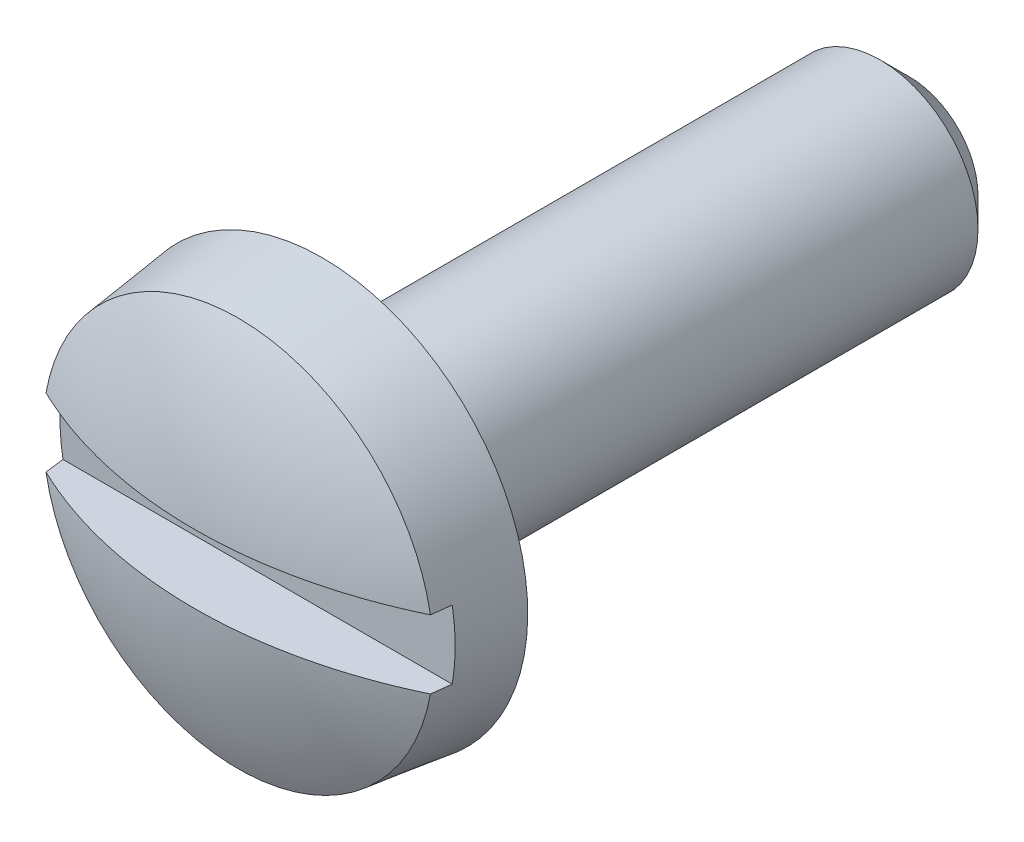
ISO-10303-21;
HEADER;
FILE_DESCRIPTION(('STEP AP214'),'2;1');
FILE_NAME('part.step','',(''),(''),'','','');
FILE_SCHEMA(('AUTOMOTIVE_DESIGN { 1 0 10303 214 1 1 1 1 }'));
ENDSEC;
DATA;
#1=APPLICATION_CONTEXT('core data for automotive mechanical design processes');
#2=APPLICATION_PROTOCOL_DEFINITION('international standard','automotive_design',2000,#1);
#3=PRODUCT_CONTEXT('',#1,'mechanical');
#4=PRODUCT('Part','Part','',(#3));
#5=PRODUCT_RELATED_PRODUCT_CATEGORY('part','',(#4));
#6=PRODUCT_DEFINITION_FORMATION('','',#4);
#7=PRODUCT_DEFINITION_CONTEXT('part definition',#1,'design');
#8=PRODUCT_DEFINITION('design','',#6,#7);
#9=PRODUCT_DEFINITION_SHAPE('','',#8);
#10=(LENGTH_UNIT() NAMED_UNIT(*) SI_UNIT(.MILLI.,.METRE.));
#11=(NAMED_UNIT(*) PLANE_ANGLE_UNIT() SI_UNIT($,.RADIAN.));
#12=(NAMED_UNIT(*) SI_UNIT($,.STERADIAN.) SOLID_ANGLE_UNIT());
#13=UNCERTAINTY_MEASURE_WITH_UNIT(LENGTH_MEASURE(1.E-05),#10,'distance_accuracy_value','');
#14=(GEOMETRIC_REPRESENTATION_CONTEXT(3) GLOBAL_UNCERTAINTY_ASSIGNED_CONTEXT((#13)) GLOBAL_UNIT_ASSIGNED_CONTEXT((#10,
#11,#12)) REPRESENTATION_CONTEXT('',''));
#15=CARTESIAN_POINT('',(0.,0.,0.));
#16=DIRECTION('',(0.,0.,1.));
#17=DIRECTION('',(1.,0.,0.));
#18=AXIS2_PLACEMENT_3D('',#15,#16,#17);
#19=CARTESIAN_POINT('',(0.,3.175,0.));
#20=DIRECTION('',(0.,0.,-1.));
#21=DIRECTION('',(-1.,0.,0.));
#22=AXIS2_PLACEMENT_3D('',#19,#20,#21);
#23=PLANE('',#22);
#24=CARTESIAN_POINT('',(0.,0.,0.));
#25=DIRECTION('',(0.,0.,1.));
#26=DIRECTION('',(1.,0.,0.));
#27=AXIS2_PLACEMENT_3D('',#24,#25,#26);
#28=CIRCLE('',#27,3.175);
#29=CARTESIAN_POINT('',(3.175,0.,0.));
#30=VERTEX_POINT('',#29);
#31=EDGE_CURVE('E57',#30,#30,#28,.T.);
#32=ORIENTED_EDGE('',*,*,#31,.T.);
#33=EDGE_LOOP('',(#32));
#34=FACE_BOUND('',#33,.T.);
#35=ADVANCED_FACE('F46',(#34),#23,.F.);
#36=CARTESIAN_POINT('',(0.,0.,-19.05));
#37=DIRECTION('',(0.,0.,1.));
#38=DIRECTION('',(1.,0.,0.));
#39=AXIS2_PLACEMENT_3D('',#36,#37,#38);
#40=PLANE('',#39);
#41=CARTESIAN_POINT('',(0.,0.,-19.05));
#42=DIRECTION('',(0.,0.,1.));
#43=DIRECTION('',(1.,0.,0.));
#44=AXIS2_PLACEMENT_3D('',#41,#42,#43);
#45=CIRCLE('',#44,2.2225);
#46=CARTESIAN_POINT('',(2.2225,0.,-19.05));
#47=VERTEX_POINT('',#46);
#48=EDGE_CURVE('E11',#47,#47,#45,.F.);
#49=ORIENTED_EDGE('',*,*,#48,.T.);
#50=EDGE_LOOP('',(#49));
#51=FACE_BOUND('',#50,.T.);
#52=ADVANCED_FACE('F67',(#51),#40,.F.);
#53=CARTESIAN_POINT('',(0.,0.,0.));
#54=DIRECTION('',(0.,0.,1.));
#55=DIRECTION('',(1.,0.,0.));
#56=AXIS2_PLACEMENT_3D('',#53,#54,#55);
#57=CYLINDRICAL_SURFACE('',#56,3.175);
#58=CARTESIAN_POINT('',(0.,0.,-18.0975));
#59=DIRECTION('',(0.,0.,1.));
#60=DIRECTION('',(1.,0.,0.));
#61=AXIS2_PLACEMENT_3D('',#58,#59,#60);
#62=CIRCLE('',#61,3.175);
#63=CARTESIAN_POINT('',(3.175,0.,-18.0975));
#64=VERTEX_POINT('',#63);
#65=EDGE_CURVE('E53',#64,#64,#62,.T.);
#66=ORIENTED_EDGE('',*,*,#65,.T.);
#67=EDGE_LOOP('',(#66));
#68=FACE_BOUND('',#67,.T.);
#69=ORIENTED_EDGE('',*,*,#31,.F.);
#70=EDGE_LOOP('',(#69));
#71=FACE_BOUND('',#70,.T.);
#72=ADVANCED_FACE('F65',(#68,#71),#57,.T.);
#73=CARTESIAN_POINT('',(0.,0.,-18.0975));
#74=DIRECTION('',(0.,0.,1.));
#75=DIRECTION('',(1.,0.,0.));
#76=AXIS2_PLACEMENT_3D('',#73,#74,#75);
#77=CONICAL_SURFACE('',#76,3.175,0.785398163397451);
#78=ORIENTED_EDGE('',*,*,#48,.F.);
#79=EDGE_LOOP('',(#78));
#80=FACE_BOUND('',#79,.T.);
#81=ORIENTED_EDGE('',*,*,#65,.F.);
#82=EDGE_LOOP('',(#81));
#83=FACE_BOUND('',#82,.T.);
#84=ADVANCED_FACE('F48',(#80,#83),#77,.T.);
#85=CLOSED_SHELL('',(#35,#52,#72,#84));
#86=MANIFOLD_SOLID_BREP('B2',#85);
#87=CARTESIAN_POINT('',(0.,0.,-10.2135901529645));
#88=DIRECTION('',(0.,0.,-1.));
#89=DIRECTION('',(0.,1.,0.));
#90=AXIS2_PLACEMENT_3D('',#87,#88,#89);
#91=SPHERICAL_SURFACE('',#90,14.4045901529645);
#92=CARTESIAN_POINT('',(0.,0.,2.72415));
#93=DIRECTION('',(0.,0.,-1.));
#94=DIRECTION('',(0.,1.,0.));
#95=AXIS2_PLACEMENT_3D('',#92,#93,#94);
#96=CIRCLE('',#95,6.33301643841637);
#97=CARTESIAN_POINT('',(-6.2347590688616,1.11125,2.72415));
#98=VERTEX_POINT('',#97);
#99=CARTESIAN_POINT('',(6.2347590688616,1.11125,2.72415));
#100=VERTEX_POINT('',#99);
#101=EDGE_CURVE('E202',#98,#100,#96,.T.);
#102=ORIENTED_EDGE('',*,*,#101,.F.);
#103=CARTESIAN_POINT('',(0.,1.11125,-10.2135901529645));
#104=DIRECTION('',(0.,1.,0.));
#105=DIRECTION('',(-1.,0.,0.));
#106=AXIS2_PLACEMENT_3D('',#103,#104,#105);
#107=CIRCLE('',#106,14.361662191835);
#108=EDGE_CURVE('E203',#98,#100,#107,.T.);
#109=ORIENTED_EDGE('',*,*,#108,.T.);
#110=EDGE_LOOP('',(#102,#109));
#111=FACE_BOUND('',#110,.T.);
#112=ADVANCED_FACE('F101',(#111),#91,.T.);
#113=CARTESIAN_POINT('',(0.,0.,0.));
#114=DIRECTION('',(0.,0.,1.));
#115=DIRECTION('',(1.,0.,0.));
#116=AXIS2_PLACEMENT_3D('',#113,#114,#115);
#117=PLANE('',#116);
#118=CARTESIAN_POINT('',(0.,0.,0.));
#119=DIRECTION('',(0.,0.,-1.));
#120=DIRECTION('',(0.,1.,0.));
#121=AXIS2_PLACEMENT_3D('',#118,#119,#120);
#122=CIRCLE('',#121,6.6675);
#123=CARTESIAN_POINT('',(0.,6.6675,0.));
#124=VERTEX_POINT('',#123);
#125=EDGE_CURVE('E205',#124,#124,#122,.T.);
#126=ORIENTED_EDGE('',*,*,#125,.T.);
#127=EDGE_LOOP('',(#126));
#128=FACE_BOUND('',#127,.T.);
#129=ADVANCED_FACE('F103',(#128),#117,.F.);
#130=CARTESIAN_POINT('',(0.,0.,2.72415));
#131=DIRECTION('',(0.,0.,-1.));
#132=DIRECTION('',(0.,1.,0.));
#133=AXIS2_PLACEMENT_3D('',#130,#131,#132);
#134=CONICAL_SURFACE('',#133,6.33301643841637,0.122173047639597);
#135=CARTESIAN_POINT('',(0.,0.,2.0955));
#136=DIRECTION('',(0.,0.,1.));
#137=DIRECTION('',(1.,0.,0.));
#138=AXIS2_PLACEMENT_3D('',#135,#136,#137);
#139=CIRCLE('',#138,6.41020495262798);
#140=CARTESIAN_POINT('',(-6.31314905353867,1.11125,2.0955));
#141=VERTEX_POINT('',#140);
#142=CARTESIAN_POINT('',(-6.31314905353867,-1.11125,2.0955));
#143=VERTEX_POINT('',#142);
#144=EDGE_CURVE('E44',#141,#143,#139,.T.);
#145=ORIENTED_EDGE('',*,*,#144,.F.);
#146=CARTESIAN_POINT('',(-7.65181904568313,1.11125,-8.67038739499354));
#147=CARTESIAN_POINT('',(-7.41941652773067,1.11125,-6.79734801947012));
#148=CARTESIAN_POINT('',(-7.18681769576233,1.11125,-4.92433296235308));
#149=CARTESIAN_POINT('',(-6.72104041720601,1.11125,-1.17837530600329));
#150=CARTESIAN_POINT('',(-6.48786197073327,1.11125,0.694567293243784));
#151=CARTESIAN_POINT('',(-6.02073835613319,1.11125,4.4403571835926));
#152=CARTESIAN_POINT('',(-5.78679318791327,1.11125,6.3132044746828));
#153=CARTESIAN_POINT('',(-5.31775749177123,1.11125,10.0587559766337));
#154=CARTESIAN_POINT('',(-5.08266696361649,1.11125,11.9314601874652));
#155=CARTESIAN_POINT('',(-4.84681446986026,1.11125,13.8040687048268));
#156=B_SPLINE_CURVE_WITH_KNOTS('',3,(#146,#147,#148,#149,#150,#151,#152,#153,#154,#155),
.UNSPECIFIED.,.F.,.F.,(4,2,2,2,4),(0.,5.66220693258291,11.3244127396948,16.9866192306255,
22.6488268715924),.UNSPECIFIED.);
#157=EDGE_CURVE('E160',#141,#98,#156,.T.);
#158=ORIENTED_EDGE('',*,*,#157,.T.);
#159=ORIENTED_EDGE('',*,*,#101,.T.);
#160=CARTESIAN_POINT('',(4.84681446986026,1.11125,13.8040687048268));
#161=CARTESIAN_POINT('',(5.03145446269914,1.11125,12.3381843355245));
#162=CARTESIAN_POINT('',(5.21561228433992,1.11125,10.8722393521325));
#163=CARTESIAN_POINT('',(5.58316918920786,1.11125,7.94025439800239));
#164=CARTESIAN_POINT('',(5.7665682725099,1.11125,6.47421442727369));
#165=CARTESIAN_POINT('',(6.05130854805375,1.11125,4.19459081056855));
#166=CARTESIAN_POINT('',(6.15284113089944,1.11125,3.38103105333985));
#167=CARTESIAN_POINT('',(6.48786623928102,1.11125,0.694567624813456));
#168=CARTESIAN_POINT('',(6.72104259317437,1.11125,-1.17837547662051));
#169=CARTESIAN_POINT('',(7.1868156308481,1.11125,-4.9243336888243));
#170=CARTESIAN_POINT('',(7.41941231465208,1.11125,-6.79734879959118));
#171=CARTESIAN_POINT('',(7.65181904568313,1.11125,-8.67038739499354));
#172=B_SPLINE_CURVE_WITH_KNOTS('',3,(#160,#161,#162,#163,#164,#165,#166,#167,#168,#169,#170,
#171),.UNSPECIFIED.,.F.,.F.,(4,2,2,2,2,4),(0.,4.4324009321609,8.86480142684579,11.3244142128297,
16.9866206978936,22.6488269525244),.UNSPECIFIED.);
#173=CARTESIAN_POINT('',(6.31314905353867,1.11125,2.0955));
#174=VERTEX_POINT('',#173);
#175=EDGE_CURVE('E124',#100,#174,#172,.T.);
#176=ORIENTED_EDGE('',*,*,#175,.T.);
#177=CARTESIAN_POINT('',(6.31314905353867,-1.11125,2.0955));
#178=VERTEX_POINT('',#177);
#179=EDGE_CURVE('E105',#178,#174,#139,.T.);
#180=ORIENTED_EDGE('',*,*,#179,.F.);
#181=CARTESIAN_POINT('',(7.65181904568313,-1.11125,-8.67038739499354));
#182=CARTESIAN_POINT('',(7.41941652773067,-1.11125,-6.79734801947012));
#183=CARTESIAN_POINT('',(7.18681769576233,-1.11125,-4.92433296235308));
#184=CARTESIAN_POINT('',(6.72104041720601,-1.11125,-1.17837530600329));
#185=CARTESIAN_POINT('',(6.48786197073327,-1.11125,0.694567293243784));
#186=CARTESIAN_POINT('',(6.02073835613319,-1.11125,4.4403571835926));
#187=CARTESIAN_POINT('',(5.78679318791327,-1.11125,6.3132044746828));
#188=CARTESIAN_POINT('',(5.31775749177123,-1.11125,10.0587559766337));
#189=CARTESIAN_POINT('',(5.08266696361649,-1.11125,11.9314601874652));
#190=CARTESIAN_POINT('',(4.84681446986026,-1.11125,13.8040687048268));
#191=B_SPLINE_CURVE_WITH_KNOTS('',3,(#181,#182,#183,#184,#185,#186,#187,#188,#189,#190),
.UNSPECIFIED.,.F.,.F.,(4,2,2,2,4),(0.,5.66220693258291,11.3244127396948,16.9866192306255,
22.6488268715924),.UNSPECIFIED.);
#192=CARTESIAN_POINT('',(6.2347590688616,-1.11125,2.72415));
#193=VERTEX_POINT('',#192);
#194=EDGE_CURVE('E152',#178,#193,#191,.T.);
#195=ORIENTED_EDGE('',*,*,#194,.T.);
#196=CARTESIAN_POINT('',(-6.2347590688616,-1.11125,2.72415));
#197=VERTEX_POINT('',#196);
#198=EDGE_CURVE('E158',#193,#197,#96,.T.);
#199=ORIENTED_EDGE('',*,*,#198,.T.);
#200=CARTESIAN_POINT('',(-4.84681446986026,-1.11125,13.8040687048268));
#201=CARTESIAN_POINT('',(-5.03145446269914,-1.11125,12.3381843355245));
#202=CARTESIAN_POINT('',(-5.21561228433993,-1.11125,10.8722393521325));
#203=CARTESIAN_POINT('',(-5.58316918920786,-1.11125,7.94025439800239));
#204=CARTESIAN_POINT('',(-5.7665682725099,-1.11125,6.47421442727369));
#205=CARTESIAN_POINT('',(-6.05130854805375,-1.11125,4.19459081056855));
#206=CARTESIAN_POINT('',(-6.15284113089944,-1.11125,3.38103105333985));
#207=CARTESIAN_POINT('',(-6.48786623928102,-1.11125,0.694567624813458));
#208=CARTESIAN_POINT('',(-6.72104259317437,-1.11125,-1.1783754766205));
#209=CARTESIAN_POINT('',(-7.1868156308481,-1.11125,-4.92433368882429));
#210=CARTESIAN_POINT('',(-7.41941231465208,-1.11125,-6.79734879959118));
#211=CARTESIAN_POINT('',(-7.65181904568312,-1.11125,-8.67038739499354));
#212=B_SPLINE_CURVE_WITH_KNOTS('',3,(#200,#201,#202,#203,#204,#205,#206,#207,#208,#209,#210,
#211),.UNSPECIFIED.,.F.,.F.,(4,2,2,2,2,4),(0.,4.4324009321609,8.86480142684579,11.3244142128297,
16.9866206978936,22.6488269525244),.UNSPECIFIED.);
#213=EDGE_CURVE('E116',#197,#143,#212,.T.);
#214=ORIENTED_EDGE('',*,*,#213,.T.);
#215=EDGE_LOOP('',(#145,#158,#159,#176,#180,#195,#199,#214));
#216=FACE_BOUND('',#215,.T.);
#217=ORIENTED_EDGE('',*,*,#125,.F.);
#218=EDGE_LOOP('',(#217));
#219=FACE_BOUND('',#218,.T.);
#220=ADVANCED_FACE('F155',(#216,#219),#134,.T.);
#221=ORIENTED_EDGE('',*,*,#198,.F.);
#222=CARTESIAN_POINT('',(0.,-1.11125,-10.2135901529645));
#223=DIRECTION('',(0.,-1.,0.));
#224=DIRECTION('',(1.,0.,0.));
#225=AXIS2_PLACEMENT_3D('',#222,#223,#224);
#226=CIRCLE('',#225,14.361662191835);
#227=EDGE_CURVE('E213',#193,#197,#226,.T.);
#228=ORIENTED_EDGE('',*,*,#227,.T.);
#229=EDGE_LOOP('',(#221,#228));
#230=FACE_BOUND('',#229,.T.);
#231=ADVANCED_FACE('F186',(#230),#91,.T.);
#232=CARTESIAN_POINT('',(-6.6675,-1.11125,2.0955));
#233=DIRECTION('',(0.,0.,1.));
#234=DIRECTION('',(1.,0.,0.));
#235=AXIS2_PLACEMENT_3D('',#232,#233,#234);
#236=PLANE('',#235);
#237=ORIENTED_EDGE('',*,*,#144,.T.);
#238=DIRECTION('',(1.,0.,0.));
#239=VECTOR('',#238,1.);
#240=CARTESIAN_POINT('',(-6.6675,-1.11125,2.0955));
#241=LINE('',#240,#239);
#242=EDGE_CURVE('E145',#143,#178,#241,.T.);
#243=ORIENTED_EDGE('',*,*,#242,.T.);
#244=ORIENTED_EDGE('',*,*,#179,.T.);
#245=DIRECTION('',(-1.,0.,0.));
#246=VECTOR('',#245,1.);
#247=CARTESIAN_POINT('',(-6.6675,1.11125,2.0955));
#248=LINE('',#247,#246);
#249=EDGE_CURVE('E147',#174,#141,#248,.T.);
#250=ORIENTED_EDGE('',*,*,#249,.T.);
#251=EDGE_LOOP('',(#237,#243,#244,#250));
#252=FACE_BOUND('',#251,.T.);
#253=ADVANCED_FACE('F144',(#252),#236,.T.);
#254=CARTESIAN_POINT('',(-6.6675,1.11125,2.0955));
#255=DIRECTION('',(0.,1.,0.));
#256=DIRECTION('',(-1.,0.,0.));
#257=AXIS2_PLACEMENT_3D('',#254,#255,#256);
#258=PLANE('',#257);
#259=ORIENTED_EDGE('',*,*,#249,.F.);
#260=ORIENTED_EDGE('',*,*,#175,.F.);
#261=ORIENTED_EDGE('',*,*,#108,.F.);
#262=ORIENTED_EDGE('',*,*,#157,.F.);
#263=EDGE_LOOP('',(#259,#260,#261,#262));
#264=FACE_BOUND('',#263,.T.);
#265=ADVANCED_FACE('F183',(#264),#258,.F.);
#266=CARTESIAN_POINT('',(-6.6675,-1.11125,2.0955));
#267=DIRECTION('',(0.,-1.,0.));
#268=DIRECTION('',(1.,0.,0.));
#269=AXIS2_PLACEMENT_3D('',#266,#267,#268);
#270=PLANE('',#269);
#271=ORIENTED_EDGE('',*,*,#227,.F.);
#272=ORIENTED_EDGE('',*,*,#194,.F.);
#273=ORIENTED_EDGE('',*,*,#242,.F.);
#274=ORIENTED_EDGE('',*,*,#213,.F.);
#275=EDGE_LOOP('',(#271,#272,#273,#274));
#276=FACE_BOUND('',#275,.T.);
#277=ADVANCED_FACE('F150',(#276),#270,.F.);
#278=CLOSED_SHELL('',(#112,#129,#220,#231,#253,#265,#277));
#279=MANIFOLD_SOLID_BREP('B6',#278);
#280=ADVANCED_BREP_SHAPE_REPRESENTATION('',(#18,#86,#279),#14);
#281=SHAPE_DEFINITION_REPRESENTATION(#9,#280);
ENDSEC;
END-ISO-10303-21;
